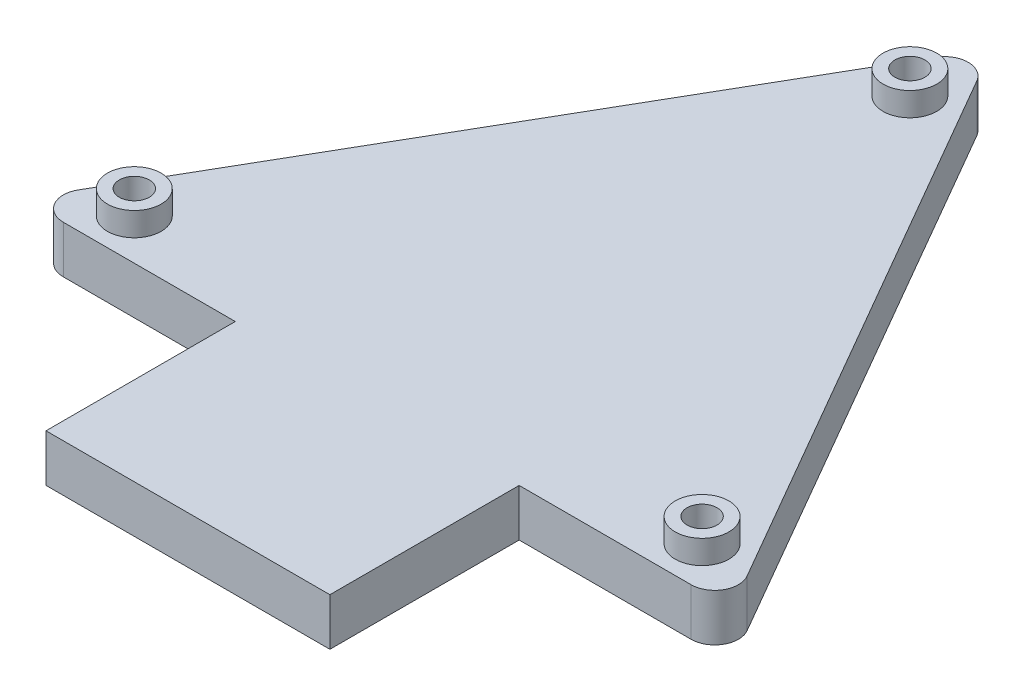
ISO-10303-21;
HEADER;
FILE_DESCRIPTION(('STEP AP214'),'2;1');
FILE_NAME('part.step','',(''),(''),'','','');
FILE_SCHEMA(('AUTOMOTIVE_DESIGN { 1 0 10303 214 1 1 1 1 }'));
ENDSEC;
DATA;
#1=APPLICATION_CONTEXT('core data for automotive mechanical design processes');
#2=APPLICATION_PROTOCOL_DEFINITION('international standard','automotive_design',2000,#1);
#3=PRODUCT_CONTEXT('',#1,'mechanical');
#4=PRODUCT('Part','Part','',(#3));
#5=PRODUCT_RELATED_PRODUCT_CATEGORY('part','',(#4));
#6=PRODUCT_DEFINITION_FORMATION('','',#4);
#7=PRODUCT_DEFINITION_CONTEXT('part definition',#1,'design');
#8=PRODUCT_DEFINITION('design','',#6,#7);
#9=PRODUCT_DEFINITION_SHAPE('','',#8);
#10=(LENGTH_UNIT() NAMED_UNIT(*) SI_UNIT(.MILLI.,.METRE.));
#11=(NAMED_UNIT(*) PLANE_ANGLE_UNIT() SI_UNIT($,.RADIAN.));
#12=(NAMED_UNIT(*) SI_UNIT($,.STERADIAN.) SOLID_ANGLE_UNIT());
#13=UNCERTAINTY_MEASURE_WITH_UNIT(LENGTH_MEASURE(1.E-05),#10,'distance_accuracy_value','');
#14=(GEOMETRIC_REPRESENTATION_CONTEXT(3) GLOBAL_UNCERTAINTY_ASSIGNED_CONTEXT((#13)) GLOBAL_UNIT_ASSIGNED_CONTEXT((#10,
#11,#12)) REPRESENTATION_CONTEXT('',''));
#15=CARTESIAN_POINT('',(0.,0.,0.));
#16=DIRECTION('',(0.,0.,1.));
#17=DIRECTION('',(1.,0.,0.));
#18=AXIS2_PLACEMENT_3D('',#15,#16,#17);
#19=CARTESIAN_POINT('',(141.339745962156,10.,-5.));
#20=DIRECTION('',(0.,1.,0.));
#21=DIRECTION('',(0.,0.,1.));
#22=AXIS2_PLACEMENT_3D('',#19,#20,#21);
#23=PLANE('',#22);
#24=CARTESIAN_POINT('',(135.,10.,-8.66025403784437));
#25=DIRECTION('',(0.,1.,0.));
#26=DIRECTION('',(0.,0.,1.));
#27=AXIS2_PLACEMENT_3D('',#24,#25,#26);
#28=CIRCLE('',#27,5.67500000000002);
#29=CARTESIAN_POINT('',(135.,10.,-2.98525403784435));
#30=VERTEX_POINT('',#29);
#31=EDGE_CURVE('E227',#30,#30,#28,.T.);
#32=ORIENTED_EDGE('',*,*,#31,.F.);
#33=EDGE_LOOP('',(#32));
#34=FACE_BOUND('',#33,.T.);
#35=DIRECTION('',(1.,0.,0.));
#36=VECTOR('',#35,1.);
#37=CARTESIAN_POINT('',(105.000000037844,10.,0.));
#38=LINE('',#37,#36);
#39=CARTESIAN_POINT('',(105.000000037844,10.,0.));
#40=VERTEX_POINT('',#39);
#41=CARTESIAN_POINT('',(141.339746037844,10.,0.));
#42=VERTEX_POINT('',#41);
#43=EDGE_CURVE('E161',#40,#42,#38,.T.);
#44=ORIENTED_EDGE('',*,*,#43,.T.);
#45=CARTESIAN_POINT('',(141.339745962156,10.,-5.));
#46=DIRECTION('',(0.,1.,0.));
#47=DIRECTION('',(0.,0.,1.));
#48=AXIS2_PLACEMENT_3D('',#45,#46,#47);
#49=CIRCLE('',#48,5.00000000000001);
#50=CARTESIAN_POINT('',(145.669872981078,10.,-7.50000000000007));
#51=VERTEX_POINT('',#50);
#52=EDGE_CURVE('E99',#42,#51,#49,.T.);
#53=ORIENTED_EDGE('',*,*,#52,.T.);
#54=DIRECTION('',(-0.500000000000001,0.,-0.866025403784438));
#55=VECTOR('',#54,1.);
#56=CARTESIAN_POINT('',(145.669872981078,10.,-7.50000000000007));
#57=LINE('',#56,#55);
#58=CARTESIAN_POINT('',(79.3301270189219,10.,-122.403810567666));
#59=VERTEX_POINT('',#58);
#60=EDGE_CURVE('E182',#51,#59,#57,.T.);
#61=ORIENTED_EDGE('',*,*,#60,.T.);
#62=CARTESIAN_POINT('',(74.9999999999997,10.,-119.903810567666));
#63=DIRECTION('',(0.,1.,0.));
#64=DIRECTION('',(0.,0.,-1.));
#65=AXIS2_PLACEMENT_3D('',#62,#63,#64);
#66=CIRCLE('',#65,5.);
#67=CARTESIAN_POINT('',(70.6698729810775,10.,-122.403810567666));
#68=VERTEX_POINT('',#67);
#69=EDGE_CURVE('E201',#59,#68,#66,.T.);
#70=ORIENTED_EDGE('',*,*,#69,.T.);
#71=DIRECTION('',(-0.499999999999998,0.,0.86602540378444));
#72=VECTOR('',#71,1.);
#73=CARTESIAN_POINT('',(4.33012701892216,10.,-7.49999999999999));
#74=LINE('',#73,#72);
#75=CARTESIAN_POINT('',(4.33012701892216,10.,-7.49999999999999));
#76=VERTEX_POINT('',#75);
#77=EDGE_CURVE('E198',#68,#76,#74,.T.);
#78=ORIENTED_EDGE('',*,*,#77,.T.);
#79=CARTESIAN_POINT('',(8.66025403784436,10.,-4.99999999999999));
#80=DIRECTION('',(0.,1.,0.));
#81=DIRECTION('',(0.,0.,-1.));
#82=AXIS2_PLACEMENT_3D('',#79,#80,#81);
#83=CIRCLE('',#82,5.);
#84=CARTESIAN_POINT('',(8.66025403784436,10.,0.));
#85=VERTEX_POINT('',#84);
#86=EDGE_CURVE('E200',#76,#85,#83,.T.);
#87=ORIENTED_EDGE('',*,*,#86,.T.);
#88=DIRECTION('',(1.,0.,0.));
#89=VECTOR('',#88,1.);
#90=CARTESIAN_POINT('',(8.66025403784436,10.,0.));
#91=LINE('',#90,#89);
#92=CARTESIAN_POINT('',(45.0000000378444,10.,0.));
#93=VERTEX_POINT('',#92);
#94=EDGE_CURVE('E124',#85,#93,#91,.T.);
#95=ORIENTED_EDGE('',*,*,#94,.T.);
#96=DIRECTION('',(0.,0.,1.));
#97=VECTOR('',#96,1.);
#98=CARTESIAN_POINT('',(45.0000000378444,10.,40.));
#99=LINE('',#98,#97);
#100=CARTESIAN_POINT('',(45.0000000378444,10.,40.));
#101=VERTEX_POINT('',#100);
#102=EDGE_CURVE('E118',#93,#101,#99,.T.);
#103=ORIENTED_EDGE('',*,*,#102,.T.);
#104=DIRECTION('',(1.,0.,0.));
#105=VECTOR('',#104,1.);
#106=CARTESIAN_POINT('',(45.0000000378444,10.,40.));
#107=LINE('',#106,#105);
#108=CARTESIAN_POINT('',(105.000000037844,10.,40.));
#109=VERTEX_POINT('',#108);
#110=EDGE_CURVE('E122',#101,#109,#107,.T.);
#111=ORIENTED_EDGE('',*,*,#110,.T.);
#112=DIRECTION('',(0.,0.,-1.));
#113=VECTOR('',#112,1.);
#114=CARTESIAN_POINT('',(105.000000037844,10.,40.));
#115=LINE('',#114,#113);
#116=EDGE_CURVE('E50',#109,#40,#115,.T.);
#117=ORIENTED_EDGE('',*,*,#116,.T.);
#118=EDGE_LOOP('',(#44,#53,#61,#70,#78,#87,#95,#103,#111,#117));
#119=FACE_BOUND('',#118,.T.);
#120=CARTESIAN_POINT('',(15.,10.,-8.66025403784437));
#121=DIRECTION('',(0.,1.,0.));
#122=DIRECTION('',(0.,0.,1.));
#123=AXIS2_PLACEMENT_3D('',#120,#121,#122);
#124=CIRCLE('',#123,5.675);
#125=CARTESIAN_POINT('',(15.,10.,-2.98525403784437));
#126=VERTEX_POINT('',#125);
#127=EDGE_CURVE('E218',#126,#126,#124,.T.);
#128=ORIENTED_EDGE('',*,*,#127,.F.);
#129=EDGE_LOOP('',(#128));
#130=FACE_BOUND('',#129,.T.);
#131=CARTESIAN_POINT('',(75.,10.,-112.583302491977));
#132=DIRECTION('',(0.,1.,0.));
#133=DIRECTION('',(0.,0.,1.));
#134=AXIS2_PLACEMENT_3D('',#131,#132,#133);
#135=CIRCLE('',#134,5.67499999999999);
#136=CARTESIAN_POINT('',(75.,10.,-106.908302491977));
#137=VERTEX_POINT('',#136);
#138=EDGE_CURVE('E236',#137,#137,#135,.T.);
#139=ORIENTED_EDGE('',*,*,#138,.F.);
#140=EDGE_LOOP('',(#139));
#141=FACE_BOUND('',#140,.T.);
#142=ADVANCED_FACE('F33',(#34,#119,#130,#141),#23,.T.);
#143=CARTESIAN_POINT('',(141.339745962156,0.,-5.));
#144=DIRECTION('',(0.,1.,0.));
#145=DIRECTION('',(0.,0.,1.));
#146=AXIS2_PLACEMENT_3D('',#143,#144,#145);
#147=PLANE('',#146);
#148=DIRECTION('',(1.,0.,0.));
#149=VECTOR('',#148,1.);
#150=CARTESIAN_POINT('',(105.000000037844,0.,0.));
#151=LINE('',#150,#149);
#152=CARTESIAN_POINT('',(105.000000037844,0.,0.));
#153=VERTEX_POINT('',#152);
#154=CARTESIAN_POINT('',(141.339746037844,0.,0.));
#155=VERTEX_POINT('',#154);
#156=EDGE_CURVE('E142',#153,#155,#151,.T.);
#157=ORIENTED_EDGE('',*,*,#156,.F.);
#158=DIRECTION('',(0.,0.,-1.));
#159=VECTOR('',#158,1.);
#160=CARTESIAN_POINT('',(105.000000037844,0.,40.));
#161=LINE('',#160,#159);
#162=CARTESIAN_POINT('',(105.000000037844,0.,40.));
#163=VERTEX_POINT('',#162);
#164=EDGE_CURVE('E91',#163,#153,#161,.T.);
#165=ORIENTED_EDGE('',*,*,#164,.F.);
#166=DIRECTION('',(1.,0.,0.));
#167=VECTOR('',#166,1.);
#168=CARTESIAN_POINT('',(45.0000000378444,0.,40.));
#169=LINE('',#168,#167);
#170=CARTESIAN_POINT('',(45.0000000378444,0.,40.));
#171=VERTEX_POINT('',#170);
#172=EDGE_CURVE('E85',#171,#163,#169,.T.);
#173=ORIENTED_EDGE('',*,*,#172,.F.);
#174=DIRECTION('',(0.,0.,1.));
#175=VECTOR('',#174,1.);
#176=CARTESIAN_POINT('',(45.0000000378444,0.,40.));
#177=LINE('',#176,#175);
#178=CARTESIAN_POINT('',(45.0000000378444,0.,0.));
#179=VERTEX_POINT('',#178);
#180=EDGE_CURVE('E132',#179,#171,#177,.T.);
#181=ORIENTED_EDGE('',*,*,#180,.F.);
#182=DIRECTION('',(1.,0.,0.));
#183=VECTOR('',#182,1.);
#184=CARTESIAN_POINT('',(8.66025403784436,0.,0.));
#185=LINE('',#184,#183);
#186=CARTESIAN_POINT('',(8.66025403784436,0.,0.));
#187=VERTEX_POINT('',#186);
#188=EDGE_CURVE('E156',#187,#179,#185,.T.);
#189=ORIENTED_EDGE('',*,*,#188,.F.);
#190=CARTESIAN_POINT('',(8.66025403784436,0.,-4.99999999999999));
#191=DIRECTION('',(0.,1.,0.));
#192=DIRECTION('',(0.,0.,-1.));
#193=AXIS2_PLACEMENT_3D('',#190,#191,#192);
#194=CIRCLE('',#193,5.);
#195=CARTESIAN_POINT('',(4.33012701892216,0.,-7.49999999999999));
#196=VERTEX_POINT('',#195);
#197=EDGE_CURVE('E154',#196,#187,#194,.T.);
#198=ORIENTED_EDGE('',*,*,#197,.F.);
#199=DIRECTION('',(-0.499999999999998,0.,0.86602540378444));
#200=VECTOR('',#199,1.);
#201=CARTESIAN_POINT('',(4.33012701892216,0.,-7.49999999999999));
#202=LINE('',#201,#200);
#203=CARTESIAN_POINT('',(70.6698729810775,0.,-122.403810567666));
#204=VERTEX_POINT('',#203);
#205=EDGE_CURVE('E152',#204,#196,#202,.T.);
#206=ORIENTED_EDGE('',*,*,#205,.F.);
#207=CARTESIAN_POINT('',(74.9999999999997,0.,-119.903810567666));
#208=DIRECTION('',(0.,1.,0.));
#209=DIRECTION('',(0.,0.,-1.));
#210=AXIS2_PLACEMENT_3D('',#207,#208,#209);
#211=CIRCLE('',#210,5.);
#212=CARTESIAN_POINT('',(79.3301270189219,0.,-122.403810567666));
#213=VERTEX_POINT('',#212);
#214=EDGE_CURVE('E150',#213,#204,#211,.T.);
#215=ORIENTED_EDGE('',*,*,#214,.F.);
#216=DIRECTION('',(-0.500000000000001,0.,-0.866025403784438));
#217=VECTOR('',#216,1.);
#218=CARTESIAN_POINT('',(145.669872981078,0.,-7.50000000000007));
#219=LINE('',#218,#217);
#220=CARTESIAN_POINT('',(145.669872981078,0.,-7.50000000000007));
#221=VERTEX_POINT('',#220);
#222=EDGE_CURVE('E148',#221,#213,#219,.T.);
#223=ORIENTED_EDGE('',*,*,#222,.F.);
#224=CARTESIAN_POINT('',(141.339745962156,0.,-5.));
#225=DIRECTION('',(0.,1.,0.));
#226=DIRECTION('',(0.,0.,1.));
#227=AXIS2_PLACEMENT_3D('',#224,#225,#226);
#228=CIRCLE('',#227,5.00000000000001);
#229=EDGE_CURVE('E145',#155,#221,#228,.T.);
#230=ORIENTED_EDGE('',*,*,#229,.F.);
#231=EDGE_LOOP('',(#157,#165,#173,#181,#189,#198,#206,#215,#223,#230));
#232=FACE_BOUND('',#231,.T.);
#233=CARTESIAN_POINT('',(75.,0.,-112.583302491977));
#234=DIRECTION('',(0.,1.,0.));
#235=DIRECTION('',(0.,0.,1.));
#236=AXIS2_PLACEMENT_3D('',#233,#234,#235);
#237=CIRCLE('',#236,3.175);
#238=CARTESIAN_POINT('',(75.,0.,-109.408302491977));
#239=VERTEX_POINT('',#238);
#240=EDGE_CURVE('E146',#239,#239,#237,.T.);
#241=ORIENTED_EDGE('',*,*,#240,.T.);
#242=EDGE_LOOP('',(#241));
#243=FACE_BOUND('',#242,.T.);
#244=CARTESIAN_POINT('',(15.,0.,-8.66025403784437));
#245=DIRECTION('',(0.,1.,0.));
#246=DIRECTION('',(0.,0.,1.));
#247=AXIS2_PLACEMENT_3D('',#244,#245,#246);
#248=CIRCLE('',#247,3.175);
#249=CARTESIAN_POINT('',(15.,0.,-5.48525403784437));
#250=VERTEX_POINT('',#249);
#251=EDGE_CURVE('E211',#250,#250,#248,.T.);
#252=ORIENTED_EDGE('',*,*,#251,.T.);
#253=EDGE_LOOP('',(#252));
#254=FACE_BOUND('',#253,.T.);
#255=CARTESIAN_POINT('',(135.,0.,-8.66025403784437));
#256=DIRECTION('',(0.,1.,0.));
#257=DIRECTION('',(0.,0.,1.));
#258=AXIS2_PLACEMENT_3D('',#255,#256,#257);
#259=CIRCLE('',#258,3.175);
#260=CARTESIAN_POINT('',(135.,0.,-5.48525403784437));
#261=VERTEX_POINT('',#260);
#262=EDGE_CURVE('E214',#261,#261,#259,.T.);
#263=ORIENTED_EDGE('',*,*,#262,.T.);
#264=EDGE_LOOP('',(#263));
#265=FACE_BOUND('',#264,.T.);
#266=ADVANCED_FACE('F186',(#232,#243,#254,#265),#147,.F.);
#267=CARTESIAN_POINT('',(105.000000037844,10.,0.));
#268=DIRECTION('',(0.,0.,-1.));
#269=DIRECTION('',(-1.,0.,0.));
#270=AXIS2_PLACEMENT_3D('',#267,#268,#269);
#271=PLANE('',#270);
#272=ORIENTED_EDGE('',*,*,#156,.T.);
#273=DIRECTION('',(0.,-1.,0.));
#274=VECTOR('',#273,1.);
#275=CARTESIAN_POINT('',(141.339746037844,10.,0.));
#276=LINE('',#275,#274);
#277=EDGE_CURVE('E11',#42,#155,#276,.T.);
#278=ORIENTED_EDGE('',*,*,#277,.F.);
#279=ORIENTED_EDGE('',*,*,#43,.F.);
#280=DIRECTION('',(0.,-1.,0.));
#281=VECTOR('',#280,1.);
#282=CARTESIAN_POINT('',(105.000000037844,10.,0.));
#283=LINE('',#282,#281);
#284=EDGE_CURVE('E138',#40,#153,#283,.T.);
#285=ORIENTED_EDGE('',*,*,#284,.T.);
#286=EDGE_LOOP('',(#272,#278,#279,#285));
#287=FACE_BOUND('',#286,.T.);
#288=ADVANCED_FACE('F35',(#287),#271,.F.);
#289=CARTESIAN_POINT('',(141.339745962156,10.,-5.));
#290=DIRECTION('',(0.,-1.,0.));
#291=DIRECTION('',(0.,0.,-1.));
#292=AXIS2_PLACEMENT_3D('',#289,#290,#291);
#293=CYLINDRICAL_SURFACE('',#292,5.00000000000001);
#294=ORIENTED_EDGE('',*,*,#229,.T.);
#295=DIRECTION('',(0.,-1.,0.));
#296=VECTOR('',#295,1.);
#297=CARTESIAN_POINT('',(145.669872981078,10.,-7.50000000000007));
#298=LINE('',#297,#296);
#299=EDGE_CURVE('E42',#51,#221,#298,.T.);
#300=ORIENTED_EDGE('',*,*,#299,.F.);
#301=ORIENTED_EDGE('',*,*,#52,.F.);
#302=ORIENTED_EDGE('',*,*,#277,.T.);
#303=EDGE_LOOP('',(#294,#300,#301,#302));
#304=FACE_BOUND('',#303,.T.);
#305=ADVANCED_FACE('F293',(#304),#293,.T.);
#306=CARTESIAN_POINT('',(145.669872981078,10.,-7.50000000000007));
#307=DIRECTION('',(-0.866025403784438,0.,0.500000000000001));
#308=DIRECTION('',(0.500000000000001,0.,0.866025403784438));
#309=AXIS2_PLACEMENT_3D('',#306,#307,#308);
#310=PLANE('',#309);
#311=ORIENTED_EDGE('',*,*,#222,.T.);
#312=DIRECTION('',(0.,-1.,0.));
#313=VECTOR('',#312,1.);
#314=CARTESIAN_POINT('',(79.3301270189219,10.,-122.403810567666));
#315=LINE('',#314,#313);
#316=EDGE_CURVE('E174',#59,#213,#315,.T.);
#317=ORIENTED_EDGE('',*,*,#316,.F.);
#318=ORIENTED_EDGE('',*,*,#60,.F.);
#319=ORIENTED_EDGE('',*,*,#299,.T.);
#320=EDGE_LOOP('',(#311,#317,#318,#319));
#321=FACE_BOUND('',#320,.T.);
#322=ADVANCED_FACE('F180',(#321),#310,.F.);
#323=CARTESIAN_POINT('',(74.9999999999997,10.,-119.903810567666));
#324=DIRECTION('',(0.,-1.,0.));
#325=DIRECTION('',(0.,0.,-1.));
#326=AXIS2_PLACEMENT_3D('',#323,#324,#325);
#327=CYLINDRICAL_SURFACE('',#326,5.);
#328=ORIENTED_EDGE('',*,*,#214,.T.);
#329=DIRECTION('',(0.,-1.,0.));
#330=VECTOR('',#329,1.);
#331=CARTESIAN_POINT('',(70.6698729810775,10.,-122.403810567666));
#332=LINE('',#331,#330);
#333=EDGE_CURVE('E171',#68,#204,#332,.T.);
#334=ORIENTED_EDGE('',*,*,#333,.F.);
#335=ORIENTED_EDGE('',*,*,#69,.F.);
#336=ORIENTED_EDGE('',*,*,#316,.T.);
#337=EDGE_LOOP('',(#328,#334,#335,#336));
#338=FACE_BOUND('',#337,.T.);
#339=ADVANCED_FACE('F192',(#338),#327,.T.);
#340=CARTESIAN_POINT('',(4.33012701892216,10.,-7.49999999999999));
#341=DIRECTION('',(0.86602540378444,0.,0.499999999999998));
#342=DIRECTION('',(0.499999999999998,0.,-0.86602540378444));
#343=AXIS2_PLACEMENT_3D('',#340,#341,#342);
#344=PLANE('',#343);
#345=ORIENTED_EDGE('',*,*,#205,.T.);
#346=DIRECTION('',(0.,-1.,0.));
#347=VECTOR('',#346,1.);
#348=CARTESIAN_POINT('',(4.33012701892216,10.,-7.49999999999999));
#349=LINE('',#348,#347);
#350=EDGE_CURVE('E168',#76,#196,#349,.T.);
#351=ORIENTED_EDGE('',*,*,#350,.F.);
#352=ORIENTED_EDGE('',*,*,#77,.F.);
#353=ORIENTED_EDGE('',*,*,#333,.T.);
#354=EDGE_LOOP('',(#345,#351,#352,#353));
#355=FACE_BOUND('',#354,.T.);
#356=ADVANCED_FACE('F196',(#355),#344,.F.);
#357=CARTESIAN_POINT('',(8.66025403784436,10.,-4.99999999999999));
#358=DIRECTION('',(0.,-1.,0.));
#359=DIRECTION('',(0.,0.,-1.));
#360=AXIS2_PLACEMENT_3D('',#357,#358,#359);
#361=CYLINDRICAL_SURFACE('',#360,5.);
#362=ORIENTED_EDGE('',*,*,#197,.T.);
#363=DIRECTION('',(0.,-1.,0.));
#364=VECTOR('',#363,1.);
#365=CARTESIAN_POINT('',(8.66025403784436,10.,0.));
#366=LINE('',#365,#364);
#367=EDGE_CURVE('E165',#85,#187,#366,.T.);
#368=ORIENTED_EDGE('',*,*,#367,.F.);
#369=ORIENTED_EDGE('',*,*,#86,.F.);
#370=ORIENTED_EDGE('',*,*,#350,.T.);
#371=EDGE_LOOP('',(#362,#368,#369,#370));
#372=FACE_BOUND('',#371,.T.);
#373=ADVANCED_FACE('F283',(#372),#361,.T.);
#374=CARTESIAN_POINT('',(8.66025403784436,10.,0.));
#375=DIRECTION('',(0.,0.,-1.));
#376=DIRECTION('',(-1.,0.,0.));
#377=AXIS2_PLACEMENT_3D('',#374,#375,#376);
#378=PLANE('',#377);
#379=ORIENTED_EDGE('',*,*,#188,.T.);
#380=DIRECTION('',(0.,-1.,0.));
#381=VECTOR('',#380,1.);
#382=CARTESIAN_POINT('',(45.0000000378444,10.,0.));
#383=LINE('',#382,#381);
#384=EDGE_CURVE('E133',#93,#179,#383,.T.);
#385=ORIENTED_EDGE('',*,*,#384,.F.);
#386=ORIENTED_EDGE('',*,*,#94,.F.);
#387=ORIENTED_EDGE('',*,*,#367,.T.);
#388=EDGE_LOOP('',(#379,#385,#386,#387));
#389=FACE_BOUND('',#388,.T.);
#390=ADVANCED_FACE('F280',(#389),#378,.F.);
#391=CARTESIAN_POINT('',(45.0000000378444,10.,40.));
#392=DIRECTION('',(1.,0.,0.));
#393=DIRECTION('',(0.,0.,-1.));
#394=AXIS2_PLACEMENT_3D('',#391,#392,#393);
#395=PLANE('',#394);
#396=ORIENTED_EDGE('',*,*,#180,.T.);
#397=DIRECTION('',(0.,-1.,0.));
#398=VECTOR('',#397,1.);
#399=CARTESIAN_POINT('',(45.0000000378444,10.,40.));
#400=LINE('',#399,#398);
#401=EDGE_CURVE('E129',#101,#171,#400,.T.);
#402=ORIENTED_EDGE('',*,*,#401,.F.);
#403=ORIENTED_EDGE('',*,*,#102,.F.);
#404=ORIENTED_EDGE('',*,*,#384,.T.);
#405=EDGE_LOOP('',(#396,#402,#403,#404));
#406=FACE_BOUND('',#405,.T.);
#407=ADVANCED_FACE('F130',(#406),#395,.F.);
#408=CARTESIAN_POINT('',(45.0000000378444,10.,40.));
#409=DIRECTION('',(0.,0.,-1.));
#410=DIRECTION('',(-1.,0.,0.));
#411=AXIS2_PLACEMENT_3D('',#408,#409,#410);
#412=PLANE('',#411);
#413=ORIENTED_EDGE('',*,*,#172,.T.);
#414=DIRECTION('',(0.,-1.,0.));
#415=VECTOR('',#414,1.);
#416=CARTESIAN_POINT('',(105.000000037844,10.,40.));
#417=LINE('',#416,#415);
#418=EDGE_CURVE('E134',#109,#163,#417,.T.);
#419=ORIENTED_EDGE('',*,*,#418,.F.);
#420=ORIENTED_EDGE('',*,*,#110,.F.);
#421=ORIENTED_EDGE('',*,*,#401,.T.);
#422=EDGE_LOOP('',(#413,#419,#420,#421));
#423=FACE_BOUND('',#422,.T.);
#424=ADVANCED_FACE('F136',(#423),#412,.F.);
#425=CARTESIAN_POINT('',(105.000000037844,10.,40.));
#426=DIRECTION('',(-1.,0.,0.));
#427=DIRECTION('',(0.,0.,1.));
#428=AXIS2_PLACEMENT_3D('',#425,#426,#427);
#429=PLANE('',#428);
#430=ORIENTED_EDGE('',*,*,#164,.T.);
#431=ORIENTED_EDGE('',*,*,#284,.F.);
#432=ORIENTED_EDGE('',*,*,#116,.F.);
#433=ORIENTED_EDGE('',*,*,#418,.T.);
#434=EDGE_LOOP('',(#430,#431,#432,#433));
#435=FACE_BOUND('',#434,.T.);
#436=ADVANCED_FACE('F273',(#435),#429,.F.);
#437=CARTESIAN_POINT('',(75.,10.,-112.583302491977));
#438=DIRECTION('',(0.,-1.,0.));
#439=DIRECTION('',(0.,0.,-1.));
#440=AXIS2_PLACEMENT_3D('',#437,#438,#439);
#441=CYLINDRICAL_SURFACE('',#440,3.175);
#442=ORIENTED_EDGE('',*,*,#240,.F.);
#443=EDGE_LOOP('',(#442));
#444=FACE_BOUND('',#443,.T.);
#445=CARTESIAN_POINT('',(75.,15.,-112.583302491977));
#446=DIRECTION('',(0.,1.,0.));
#447=DIRECTION('',(0.,0.,1.));
#448=AXIS2_PLACEMENT_3D('',#445,#446,#447);
#449=CIRCLE('',#448,3.175);
#450=CARTESIAN_POINT('',(75.,15.,-109.408302491977));
#451=VERTEX_POINT('',#450);
#452=EDGE_CURVE('E239',#451,#451,#449,.T.);
#453=ORIENTED_EDGE('',*,*,#452,.T.);
#454=EDGE_LOOP('',(#453));
#455=FACE_BOUND('',#454,.T.);
#456=ADVANCED_FACE('F245',(#444,#455),#441,.F.);
#457=CARTESIAN_POINT('',(15.,10.,-8.66025403784437));
#458=DIRECTION('',(0.,-1.,0.));
#459=DIRECTION('',(0.,0.,-1.));
#460=AXIS2_PLACEMENT_3D('',#457,#458,#459);
#461=CYLINDRICAL_SURFACE('',#460,3.175);
#462=ORIENTED_EDGE('',*,*,#251,.F.);
#463=EDGE_LOOP('',(#462));
#464=FACE_BOUND('',#463,.T.);
#465=CARTESIAN_POINT('',(15.,15.,-8.66025403784437));
#466=DIRECTION('',(0.,1.,0.));
#467=DIRECTION('',(0.,0.,1.));
#468=AXIS2_PLACEMENT_3D('',#465,#466,#467);
#469=CIRCLE('',#468,3.175);
#470=CARTESIAN_POINT('',(15.,15.,-5.48525403784437));
#471=VERTEX_POINT('',#470);
#472=EDGE_CURVE('E221',#471,#471,#469,.T.);
#473=ORIENTED_EDGE('',*,*,#472,.T.);
#474=EDGE_LOOP('',(#473));
#475=FACE_BOUND('',#474,.T.);
#476=ADVANCED_FACE('F365',(#464,#475),#461,.F.);
#477=CARTESIAN_POINT('',(135.,10.,-8.66025403784437));
#478=DIRECTION('',(0.,-1.,0.));
#479=DIRECTION('',(0.,0.,-1.));
#480=AXIS2_PLACEMENT_3D('',#477,#478,#479);
#481=CYLINDRICAL_SURFACE('',#480,3.175);
#482=ORIENTED_EDGE('',*,*,#262,.F.);
#483=EDGE_LOOP('',(#482));
#484=FACE_BOUND('',#483,.T.);
#485=CARTESIAN_POINT('',(135.,15.,-8.66025403784437));
#486=DIRECTION('',(0.,1.,0.));
#487=DIRECTION('',(0.,0.,1.));
#488=AXIS2_PLACEMENT_3D('',#485,#486,#487);
#489=CIRCLE('',#488,3.175);
#490=CARTESIAN_POINT('',(135.,15.,-5.48525403784437));
#491=VERTEX_POINT('',#490);
#492=EDGE_CURVE('E230',#491,#491,#489,.T.);
#493=ORIENTED_EDGE('',*,*,#492,.T.);
#494=EDGE_LOOP('',(#493));
#495=FACE_BOUND('',#494,.T.);
#496=ADVANCED_FACE('F376',(#484,#495),#481,.F.);
#497=CARTESIAN_POINT('',(15.,15.,-8.66025403784437));
#498=DIRECTION('',(0.,1.,0.));
#499=DIRECTION('',(0.,0.,1.));
#500=AXIS2_PLACEMENT_3D('',#497,#498,#499);
#501=PLANE('',#500);
#502=CARTESIAN_POINT('',(15.,15.,-8.66025403784437));
#503=DIRECTION('',(0.,1.,0.));
#504=DIRECTION('',(0.,0.,1.));
#505=AXIS2_PLACEMENT_3D('',#502,#503,#504);
#506=CIRCLE('',#505,5.675);
#507=CARTESIAN_POINT('',(15.,15.,-2.98525403784437));
#508=VERTEX_POINT('',#507);
#509=EDGE_CURVE('E217',#508,#508,#506,.T.);
#510=ORIENTED_EDGE('',*,*,#509,.T.);
#511=EDGE_LOOP('',(#510));
#512=FACE_BOUND('',#511,.T.);
#513=ORIENTED_EDGE('',*,*,#472,.F.);
#514=EDGE_LOOP('',(#513));
#515=FACE_BOUND('',#514,.T.);
#516=ADVANCED_FACE('F385',(#512,#515),#501,.T.);
#517=CARTESIAN_POINT('',(15.,15.,-8.66025403784437));
#518=DIRECTION('',(0.,-1.,0.));
#519=DIRECTION('',(0.,0.,-1.));
#520=AXIS2_PLACEMENT_3D('',#517,#518,#519);
#521=CYLINDRICAL_SURFACE('',#520,5.675);
#522=ORIENTED_EDGE('',*,*,#509,.F.);
#523=EDGE_LOOP('',(#522));
#524=FACE_BOUND('',#523,.T.);
#525=ORIENTED_EDGE('',*,*,#127,.T.);
#526=EDGE_LOOP('',(#525));
#527=FACE_BOUND('',#526,.T.);
#528=ADVANCED_FACE('F405',(#524,#527),#521,.T.);
#529=CARTESIAN_POINT('',(135.,15.,-8.66025403784437));
#530=DIRECTION('',(0.,1.,0.));
#531=DIRECTION('',(0.,0.,1.));
#532=AXIS2_PLACEMENT_3D('',#529,#530,#531);
#533=PLANE('',#532);
#534=CARTESIAN_POINT('',(135.,15.,-8.66025403784437));
#535=DIRECTION('',(0.,1.,0.));
#536=DIRECTION('',(0.,0.,1.));
#537=AXIS2_PLACEMENT_3D('',#534,#535,#536);
#538=CIRCLE('',#537,5.67500000000002);
#539=CARTESIAN_POINT('',(135.,15.,-2.98525403784435));
#540=VERTEX_POINT('',#539);
#541=EDGE_CURVE('E226',#540,#540,#538,.T.);
#542=ORIENTED_EDGE('',*,*,#541,.T.);
#543=EDGE_LOOP('',(#542));
#544=FACE_BOUND('',#543,.T.);
#545=ORIENTED_EDGE('',*,*,#492,.F.);
#546=EDGE_LOOP('',(#545));
#547=FACE_BOUND('',#546,.T.);
#548=ADVANCED_FACE('F259',(#544,#547),#533,.T.);
#549=CARTESIAN_POINT('',(135.,15.,-8.66025403784437));
#550=DIRECTION('',(0.,-1.,0.));
#551=DIRECTION('',(0.,0.,-1.));
#552=AXIS2_PLACEMENT_3D('',#549,#550,#551);
#553=CYLINDRICAL_SURFACE('',#552,5.67500000000002);
#554=ORIENTED_EDGE('',*,*,#541,.F.);
#555=EDGE_LOOP('',(#554));
#556=FACE_BOUND('',#555,.T.);
#557=ORIENTED_EDGE('',*,*,#31,.T.);
#558=EDGE_LOOP('',(#557));
#559=FACE_BOUND('',#558,.T.);
#560=ADVANCED_FACE('F250',(#556,#559),#553,.T.);
#561=CARTESIAN_POINT('',(75.,15.,-112.583302491977));
#562=DIRECTION('',(0.,1.,0.));
#563=DIRECTION('',(0.,0.,1.));
#564=AXIS2_PLACEMENT_3D('',#561,#562,#563);
#565=PLANE('',#564);
#566=CARTESIAN_POINT('',(75.,15.,-112.583302491977));
#567=DIRECTION('',(0.,1.,0.));
#568=DIRECTION('',(0.,0.,1.));
#569=AXIS2_PLACEMENT_3D('',#566,#567,#568);
#570=CIRCLE('',#569,5.67499999999999);
#571=CARTESIAN_POINT('',(75.,15.,-106.908302491977));
#572=VERTEX_POINT('',#571);
#573=EDGE_CURVE('E235',#572,#572,#570,.T.);
#574=ORIENTED_EDGE('',*,*,#573,.T.);
#575=EDGE_LOOP('',(#574));
#576=FACE_BOUND('',#575,.T.);
#577=ORIENTED_EDGE('',*,*,#452,.F.);
#578=EDGE_LOOP('',(#577));
#579=FACE_BOUND('',#578,.T.);
#580=ADVANCED_FACE('F247',(#576,#579),#565,.T.);
#581=CARTESIAN_POINT('',(75.,15.,-112.583302491977));
#582=DIRECTION('',(0.,-1.,0.));
#583=DIRECTION('',(0.,0.,-1.));
#584=AXIS2_PLACEMENT_3D('',#581,#582,#583);
#585=CYLINDRICAL_SURFACE('',#584,5.67499999999999);
#586=ORIENTED_EDGE('',*,*,#573,.F.);
#587=EDGE_LOOP('',(#586));
#588=FACE_BOUND('',#587,.T.);
#589=ORIENTED_EDGE('',*,*,#138,.T.);
#590=EDGE_LOOP('',(#589));
#591=FACE_BOUND('',#590,.T.);
#592=ADVANCED_FACE('F249',(#588,#591),#585,.T.);
#593=CLOSED_SHELL('',(#142,#266,#288,#305,#322,#339,#356,#373,#390,#407,#424,#436,#456,#476,
#496,#516,#528,#548,#560,#580,#592));
#594=MANIFOLD_SOLID_BREP('B2',#593);
#595=ADVANCED_BREP_SHAPE_REPRESENTATION('',(#18,#594),#14);
#596=SHAPE_DEFINITION_REPRESENTATION(#9,#595);
ENDSEC;
END-ISO-10303-21;
